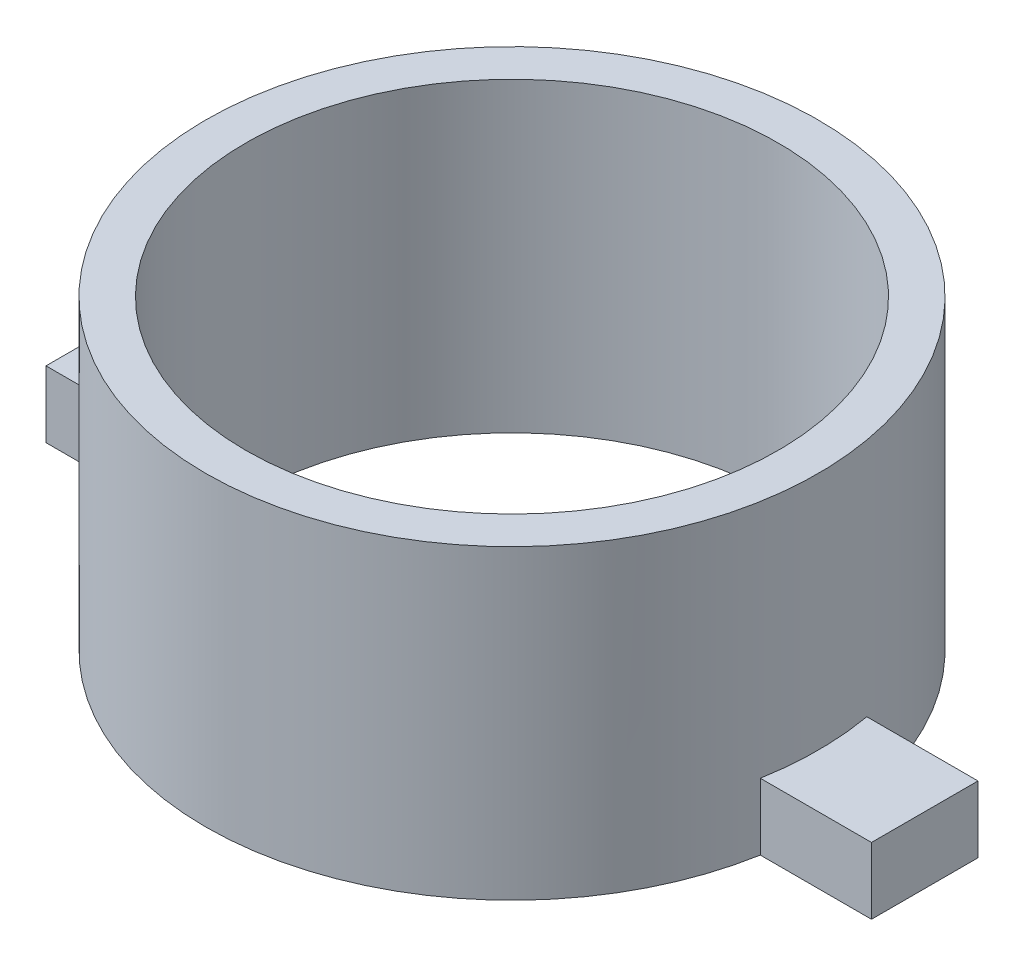
ISO-10303-21;
HEADER;
FILE_DESCRIPTION(('STEP AP214'),'2;1');
FILE_NAME('part.step','',(''),(''),'','','');
FILE_SCHEMA(('AUTOMOTIVE_DESIGN { 1 0 10303 214 1 1 1 1 }'));
ENDSEC;
DATA;
#1=APPLICATION_CONTEXT('core data for automotive mechanical design processes');
#2=APPLICATION_PROTOCOL_DEFINITION('international standard','automotive_design',2000,#1);
#3=PRODUCT_CONTEXT('',#1,'mechanical');
#4=PRODUCT('Part','Part','',(#3));
#5=PRODUCT_RELATED_PRODUCT_CATEGORY('part','',(#4));
#6=PRODUCT_DEFINITION_FORMATION('','',#4);
#7=PRODUCT_DEFINITION_CONTEXT('part definition',#1,'design');
#8=PRODUCT_DEFINITION('design','',#6,#7);
#9=PRODUCT_DEFINITION_SHAPE('','',#8);
#10=(LENGTH_UNIT() NAMED_UNIT(*) SI_UNIT(.MILLI.,.METRE.));
#11=(NAMED_UNIT(*) PLANE_ANGLE_UNIT() SI_UNIT($,.RADIAN.));
#12=(NAMED_UNIT(*) SI_UNIT($,.STERADIAN.) SOLID_ANGLE_UNIT());
#13=UNCERTAINTY_MEASURE_WITH_UNIT(LENGTH_MEASURE(1.E-05),#10,'distance_accuracy_value','');
#14=(GEOMETRIC_REPRESENTATION_CONTEXT(3) GLOBAL_UNCERTAINTY_ASSIGNED_CONTEXT((#13)) GLOBAL_UNIT_ASSIGNED_CONTEXT((#10,
#11,#12)) REPRESENTATION_CONTEXT('',''));
#15=CARTESIAN_POINT('',(0.,0.,0.));
#16=DIRECTION('',(0.,0.,1.));
#17=DIRECTION('',(1.,0.,0.));
#18=AXIS2_PLACEMENT_3D('',#15,#16,#17);
#19=CARTESIAN_POINT('',(0.,23.,0.));
#20=DIRECTION('',(0.,1.,0.));
#21=DIRECTION('',(0.,0.,1.));
#22=AXIS2_PLACEMENT_3D('',#19,#20,#21);
#23=PLANE('',#22);
#24=CARTESIAN_POINT('',(0.,23.,0.));
#25=DIRECTION('',(0.,1.,0.));
#26=DIRECTION('',(0.,0.,1.));
#27=AXIS2_PLACEMENT_3D('',#24,#25,#26);
#28=CIRCLE('',#27,23.);
#29=CARTESIAN_POINT('',(0.,23.,23.));
#30=VERTEX_POINT('',#29);
#31=EDGE_CURVE('E159',#30,#30,#28,.T.);
#32=ORIENTED_EDGE('',*,*,#31,.T.);
#33=EDGE_LOOP('',(#32));
#34=FACE_BOUND('',#33,.T.);
#35=CARTESIAN_POINT('',(0.,23.,0.));
#36=DIRECTION('',(0.,1.,0.));
#37=DIRECTION('',(0.,0.,1.));
#38=AXIS2_PLACEMENT_3D('',#35,#36,#37);
#39=CIRCLE('',#38,20.);
#40=CARTESIAN_POINT('',(0.,23.,20.));
#41=VERTEX_POINT('',#40);
#42=EDGE_CURVE('E153',#41,#41,#39,.T.);
#43=ORIENTED_EDGE('',*,*,#42,.F.);
#44=EDGE_LOOP('',(#43));
#45=FACE_BOUND('',#44,.T.);
#46=ADVANCED_FACE('F37',(#34,#45),#23,.T.);
#47=CARTESIAN_POINT('',(0.,0.,0.));
#48=DIRECTION('',(0.,1.,0.));
#49=DIRECTION('',(0.,0.,1.));
#50=AXIS2_PLACEMENT_3D('',#47,#48,#49);
#51=PLANE('',#50);
#52=DIRECTION('',(-1.,0.,0.));
#53=VECTOR('',#52,1.);
#54=CARTESIAN_POINT('',(22.,0.,4.));
#55=LINE('',#54,#53);
#56=CARTESIAN_POINT('',(31.,0.,4.));
#57=VERTEX_POINT('',#56);
#58=CARTESIAN_POINT('',(22.6495033058122,0.,4.));
#59=VERTEX_POINT('',#58);
#60=EDGE_CURVE('E104',#57,#59,#55,.T.);
#61=ORIENTED_EDGE('',*,*,#60,.T.);
#62=CARTESIAN_POINT('',(0.,0.,0.));
#63=DIRECTION('',(0.,1.,0.));
#64=DIRECTION('',(0.,0.,1.));
#65=AXIS2_PLACEMENT_3D('',#62,#63,#64);
#66=CIRCLE('',#65,23.);
#67=CARTESIAN_POINT('',(-22.6495033058122,0.,4.));
#68=VERTEX_POINT('',#67);
#69=EDGE_CURVE('E163',#68,#59,#66,.T.);
#70=ORIENTED_EDGE('',*,*,#69,.F.);
#71=DIRECTION('',(1.,0.,0.));
#72=VECTOR('',#71,1.);
#73=CARTESIAN_POINT('',(-22.,0.,4.));
#74=LINE('',#73,#72);
#75=CARTESIAN_POINT('',(-31.,0.,4.));
#76=VERTEX_POINT('',#75);
#77=EDGE_CURVE('E138',#76,#68,#74,.T.);
#78=ORIENTED_EDGE('',*,*,#77,.F.);
#79=DIRECTION('',(0.,0.,-1.));
#80=VECTOR('',#79,1.);
#81=CARTESIAN_POINT('',(-31.,0.,4.));
#82=LINE('',#81,#80);
#83=CARTESIAN_POINT('',(-31.,0.,-4.));
#84=VERTEX_POINT('',#83);
#85=EDGE_CURVE('E141',#76,#84,#82,.T.);
#86=ORIENTED_EDGE('',*,*,#85,.T.);
#87=DIRECTION('',(1.,0.,0.));
#88=VECTOR('',#87,1.);
#89=CARTESIAN_POINT('',(-22.,0.,-4.));
#90=LINE('',#89,#88);
#91=CARTESIAN_POINT('',(-22.6495033058122,0.,-4.));
#92=VERTEX_POINT('',#91);
#93=EDGE_CURVE('E136',#84,#92,#90,.T.);
#94=ORIENTED_EDGE('',*,*,#93,.T.);
#95=CARTESIAN_POINT('',(22.6495033058122,0.,-4.));
#96=VERTEX_POINT('',#95);
#97=EDGE_CURVE('E156',#96,#92,#66,.T.);
#98=ORIENTED_EDGE('',*,*,#97,.F.);
#99=DIRECTION('',(-1.,0.,0.));
#100=VECTOR('',#99,1.);
#101=CARTESIAN_POINT('',(22.,0.,-4.));
#102=LINE('',#101,#100);
#103=CARTESIAN_POINT('',(31.,0.,-4.));
#104=VERTEX_POINT('',#103);
#105=EDGE_CURVE('E106',#104,#96,#102,.T.);
#106=ORIENTED_EDGE('',*,*,#105,.F.);
#107=DIRECTION('',(0.,0.,-1.));
#108=VECTOR('',#107,1.);
#109=CARTESIAN_POINT('',(31.,0.,4.));
#110=LINE('',#109,#108);
#111=EDGE_CURVE('E99',#57,#104,#110,.T.);
#112=ORIENTED_EDGE('',*,*,#111,.F.);
#113=EDGE_LOOP('',(#61,#70,#78,#86,#94,#98,#106,#112));
#114=FACE_BOUND('',#113,.T.);
#115=CARTESIAN_POINT('',(0.,0.,0.));
#116=DIRECTION('',(0.,1.,0.));
#117=DIRECTION('',(0.,0.,1.));
#118=AXIS2_PLACEMENT_3D('',#115,#116,#117);
#119=CIRCLE('',#118,20.);
#120=CARTESIAN_POINT('',(0.,0.,20.));
#121=VERTEX_POINT('',#120);
#122=EDGE_CURVE('E152',#121,#121,#119,.T.);
#123=ORIENTED_EDGE('',*,*,#122,.T.);
#124=EDGE_LOOP('',(#123));
#125=FACE_BOUND('',#124,.T.);
#126=ADVANCED_FACE('F101',(#114,#125),#51,.F.);
#127=CARTESIAN_POINT('',(0.,23.,0.));
#128=DIRECTION('',(0.,-1.,0.));
#129=DIRECTION('',(0.,0.,-1.));
#130=AXIS2_PLACEMENT_3D('',#127,#128,#129);
#131=CYLINDRICAL_SURFACE('',#130,23.);
#132=ORIENTED_EDGE('',*,*,#31,.F.);
#133=EDGE_LOOP('',(#132));
#134=FACE_BOUND('',#133,.T.);
#135=ORIENTED_EDGE('',*,*,#69,.T.);
#136=DIRECTION('',(0.,-1.,0.));
#137=VECTOR('',#136,1.);
#138=CARTESIAN_POINT('',(22.6495033058122,23.,4.));
#139=LINE('',#138,#137);
#140=CARTESIAN_POINT('',(22.6495033058122,5.,4.));
#141=VERTEX_POINT('',#140);
#142=EDGE_CURVE('E11',#59,#141,#139,.F.);
#143=ORIENTED_EDGE('',*,*,#142,.T.);
#144=CARTESIAN_POINT('',(0.,4.99999999999999,0.));
#145=DIRECTION('',(0.,1.,0.));
#146=DIRECTION('',(-1.,0.,0.));
#147=AXIS2_PLACEMENT_3D('',#144,#145,#146);
#148=CIRCLE('',#147,23.);
#149=CARTESIAN_POINT('',(22.6495033058122,5.,-4.));
#150=VERTEX_POINT('',#149);
#151=EDGE_CURVE('E45',#141,#150,#148,.T.);
#152=ORIENTED_EDGE('',*,*,#151,.T.);
#153=DIRECTION('',(0.,-1.,0.));
#154=VECTOR('',#153,1.);
#155=CARTESIAN_POINT('',(22.6495033058122,23.,-4.));
#156=LINE('',#155,#154);
#157=EDGE_CURVE('E56',#96,#150,#156,.F.);
#158=ORIENTED_EDGE('',*,*,#157,.F.);
#159=ORIENTED_EDGE('',*,*,#97,.T.);
#160=DIRECTION('',(0.,-1.,0.));
#161=VECTOR('',#160,1.);
#162=CARTESIAN_POINT('',(-22.6495033058122,23.,-4.));
#163=LINE('',#162,#161);
#164=CARTESIAN_POINT('',(-22.6495033058122,5.,-4.));
#165=VERTEX_POINT('',#164);
#166=EDGE_CURVE('E162',#165,#92,#163,.T.);
#167=ORIENTED_EDGE('',*,*,#166,.F.);
#168=CARTESIAN_POINT('',(0.,4.99999999999999,0.));
#169=DIRECTION('',(0.,-1.,0.));
#170=DIRECTION('',(1.,0.,0.));
#171=AXIS2_PLACEMENT_3D('',#168,#169,#170);
#172=CIRCLE('',#171,23.);
#173=CARTESIAN_POINT('',(-22.6495033058122,5.,4.));
#174=VERTEX_POINT('',#173);
#175=EDGE_CURVE('E167',#174,#165,#172,.T.);
#176=ORIENTED_EDGE('',*,*,#175,.F.);
#177=DIRECTION('',(0.,-1.,0.));
#178=VECTOR('',#177,1.);
#179=CARTESIAN_POINT('',(-22.6495033058122,23.,4.));
#180=LINE('',#179,#178);
#181=EDGE_CURVE('E170',#174,#68,#180,.T.);
#182=ORIENTED_EDGE('',*,*,#181,.T.);
#183=EDGE_LOOP('',(#135,#143,#152,#158,#159,#167,#176,#182));
#184=FACE_BOUND('',#183,.T.);
#185=ADVANCED_FACE('F39',(#134,#184),#131,.T.);
#186=CARTESIAN_POINT('',(0.,23.,0.));
#187=DIRECTION('',(0.,-1.,0.));
#188=DIRECTION('',(0.,0.,-1.));
#189=AXIS2_PLACEMENT_3D('',#186,#187,#188);
#190=CYLINDRICAL_SURFACE('',#189,20.);
#191=ORIENTED_EDGE('',*,*,#42,.T.);
#192=EDGE_LOOP('',(#191));
#193=FACE_BOUND('',#192,.T.);
#194=ORIENTED_EDGE('',*,*,#122,.F.);
#195=EDGE_LOOP('',(#194));
#196=FACE_BOUND('',#195,.T.);
#197=ADVANCED_FACE('F192',(#193,#196),#190,.F.);
#198=CARTESIAN_POINT('',(0.,0.,4.));
#199=DIRECTION('',(0.,0.,1.));
#200=DIRECTION('',(1.,0.,0.));
#201=AXIS2_PLACEMENT_3D('',#198,#199,#200);
#202=PLANE('',#201);
#203=ORIENTED_EDGE('',*,*,#181,.F.);
#204=DIRECTION('',(-1.,0.,0.));
#205=VECTOR('',#204,1.);
#206=CARTESIAN_POINT('',(-22.,5.,4.));
#207=LINE('',#206,#205);
#208=CARTESIAN_POINT('',(-31.,5.,4.));
#209=VERTEX_POINT('',#208);
#210=EDGE_CURVE('E133',#174,#209,#207,.T.);
#211=ORIENTED_EDGE('',*,*,#210,.T.);
#212=DIRECTION('',(0.,-1.,0.));
#213=VECTOR('',#212,1.);
#214=CARTESIAN_POINT('',(-31.,0.,4.));
#215=LINE('',#214,#213);
#216=EDGE_CURVE('E135',#209,#76,#215,.T.);
#217=ORIENTED_EDGE('',*,*,#216,.T.);
#218=ORIENTED_EDGE('',*,*,#77,.T.);
#219=EDGE_LOOP('',(#203,#211,#217,#218));
#220=FACE_BOUND('',#219,.T.);
#221=ADVANCED_FACE('F195',(#220),#202,.T.);
#222=CARTESIAN_POINT('',(0.,0.,-4.));
#223=DIRECTION('',(0.,0.,1.));
#224=DIRECTION('',(1.,0.,0.));
#225=AXIS2_PLACEMENT_3D('',#222,#223,#224);
#226=PLANE('',#225);
#227=DIRECTION('',(-1.,0.,0.));
#228=VECTOR('',#227,1.);
#229=CARTESIAN_POINT('',(-22.,5.,-4.));
#230=LINE('',#229,#228);
#231=CARTESIAN_POINT('',(-31.,5.,-4.));
#232=VERTEX_POINT('',#231);
#233=EDGE_CURVE('E111',#165,#232,#230,.T.);
#234=ORIENTED_EDGE('',*,*,#233,.F.);
#235=ORIENTED_EDGE('',*,*,#166,.T.);
#236=ORIENTED_EDGE('',*,*,#93,.F.);
#237=DIRECTION('',(0.,-1.,0.));
#238=VECTOR('',#237,1.);
#239=CARTESIAN_POINT('',(-31.,0.,-4.));
#240=LINE('',#239,#238);
#241=EDGE_CURVE('E143',#232,#84,#240,.T.);
#242=ORIENTED_EDGE('',*,*,#241,.F.);
#243=EDGE_LOOP('',(#234,#235,#236,#242));
#244=FACE_BOUND('',#243,.T.);
#245=ADVANCED_FACE('F201',(#244),#226,.F.);
#246=CARTESIAN_POINT('',(-22.,5.,4.));
#247=DIRECTION('',(0.,-1.,0.));
#248=DIRECTION('',(1.,0.,0.));
#249=AXIS2_PLACEMENT_3D('',#246,#247,#248);
#250=PLANE('',#249);
#251=ORIENTED_EDGE('',*,*,#210,.F.);
#252=ORIENTED_EDGE('',*,*,#175,.T.);
#253=ORIENTED_EDGE('',*,*,#233,.T.);
#254=DIRECTION('',(0.,0.,-1.));
#255=VECTOR('',#254,1.);
#256=CARTESIAN_POINT('',(-31.,5.,4.));
#257=LINE('',#256,#255);
#258=EDGE_CURVE('E149',#209,#232,#257,.T.);
#259=ORIENTED_EDGE('',*,*,#258,.F.);
#260=EDGE_LOOP('',(#251,#252,#253,#259));
#261=FACE_BOUND('',#260,.T.);
#262=ADVANCED_FACE('F197',(#261),#250,.F.);
#263=CARTESIAN_POINT('',(-31.,0.,4.));
#264=DIRECTION('',(1.,0.,0.));
#265=DIRECTION('',(0.,0.,-1.));
#266=AXIS2_PLACEMENT_3D('',#263,#264,#265);
#267=PLANE('',#266);
#268=ORIENTED_EDGE('',*,*,#241,.T.);
#269=ORIENTED_EDGE('',*,*,#85,.F.);
#270=ORIENTED_EDGE('',*,*,#216,.F.);
#271=ORIENTED_EDGE('',*,*,#258,.T.);
#272=EDGE_LOOP('',(#268,#269,#270,#271));
#273=FACE_BOUND('',#272,.T.);
#274=ADVANCED_FACE('F200',(#273),#267,.F.);
#275=CARTESIAN_POINT('',(0.,0.,4.));
#276=DIRECTION('',(0.,0.,1.));
#277=DIRECTION('',(-1.,0.,0.));
#278=AXIS2_PLACEMENT_3D('',#275,#276,#277);
#279=PLANE('',#278);
#280=ORIENTED_EDGE('',*,*,#142,.F.);
#281=ORIENTED_EDGE('',*,*,#60,.F.);
#282=DIRECTION('',(0.,-1.,0.));
#283=VECTOR('',#282,1.);
#284=CARTESIAN_POINT('',(31.,0.,4.));
#285=LINE('',#284,#283);
#286=CARTESIAN_POINT('',(31.,5.,4.));
#287=VERTEX_POINT('',#286);
#288=EDGE_CURVE('E118',#287,#57,#285,.T.);
#289=ORIENTED_EDGE('',*,*,#288,.F.);
#290=DIRECTION('',(1.,0.,0.));
#291=VECTOR('',#290,1.);
#292=CARTESIAN_POINT('',(22.,5.,4.));
#293=LINE('',#292,#291);
#294=EDGE_CURVE('E124',#141,#287,#293,.T.);
#295=ORIENTED_EDGE('',*,*,#294,.F.);
#296=EDGE_LOOP('',(#280,#281,#289,#295));
#297=FACE_BOUND('',#296,.T.);
#298=ADVANCED_FACE('F116',(#297),#279,.T.);
#299=CARTESIAN_POINT('',(0.,0.,-4.));
#300=DIRECTION('',(0.,0.,1.));
#301=DIRECTION('',(-1.,0.,0.));
#302=AXIS2_PLACEMENT_3D('',#299,#300,#301);
#303=PLANE('',#302);
#304=ORIENTED_EDGE('',*,*,#105,.T.);
#305=ORIENTED_EDGE('',*,*,#157,.T.);
#306=DIRECTION('',(1.,0.,0.));
#307=VECTOR('',#306,1.);
#308=CARTESIAN_POINT('',(22.,5.,-4.));
#309=LINE('',#308,#307);
#310=CARTESIAN_POINT('',(31.,5.,-4.));
#311=VERTEX_POINT('',#310);
#312=EDGE_CURVE('E119',#150,#311,#309,.T.);
#313=ORIENTED_EDGE('',*,*,#312,.T.);
#314=DIRECTION('',(0.,-1.,0.));
#315=VECTOR('',#314,1.);
#316=CARTESIAN_POINT('',(31.,0.,-4.));
#317=LINE('',#316,#315);
#318=EDGE_CURVE('E129',#311,#104,#317,.T.);
#319=ORIENTED_EDGE('',*,*,#318,.T.);
#320=EDGE_LOOP('',(#304,#305,#313,#319));
#321=FACE_BOUND('',#320,.T.);
#322=ADVANCED_FACE('F175',(#321),#303,.F.);
#323=CARTESIAN_POINT('',(31.,0.,4.));
#324=DIRECTION('',(1.,0.,0.));
#325=DIRECTION('',(0.,0.,-1.));
#326=AXIS2_PLACEMENT_3D('',#323,#324,#325);
#327=PLANE('',#326);
#328=ORIENTED_EDGE('',*,*,#318,.F.);
#329=DIRECTION('',(0.,0.,-1.));
#330=VECTOR('',#329,1.);
#331=CARTESIAN_POINT('',(31.,5.,4.));
#332=LINE('',#331,#330);
#333=EDGE_CURVE('E112',#287,#311,#332,.T.);
#334=ORIENTED_EDGE('',*,*,#333,.F.);
#335=ORIENTED_EDGE('',*,*,#288,.T.);
#336=ORIENTED_EDGE('',*,*,#111,.T.);
#337=EDGE_LOOP('',(#328,#334,#335,#336));
#338=FACE_BOUND('',#337,.T.);
#339=ADVANCED_FACE('F122',(#338),#327,.T.);
#340=CARTESIAN_POINT('',(22.,5.,4.));
#341=DIRECTION('',(0.,1.,0.));
#342=DIRECTION('',(-1.,0.,0.));
#343=AXIS2_PLACEMENT_3D('',#340,#341,#342);
#344=PLANE('',#343);
#345=ORIENTED_EDGE('',*,*,#151,.F.);
#346=ORIENTED_EDGE('',*,*,#294,.T.);
#347=ORIENTED_EDGE('',*,*,#333,.T.);
#348=ORIENTED_EDGE('',*,*,#312,.F.);
#349=EDGE_LOOP('',(#345,#346,#347,#348));
#350=FACE_BOUND('',#349,.T.);
#351=ADVANCED_FACE('F176',(#350),#344,.T.);
#352=CLOSED_SHELL('',(#46,#126,#185,#197,#221,#245,#262,#274,#298,#322,#339,#351));
#353=MANIFOLD_SOLID_BREP('B2',#352);
#354=ADVANCED_BREP_SHAPE_REPRESENTATION('',(#18,#353),#14);
#355=SHAPE_DEFINITION_REPRESENTATION(#9,#354);
ENDSEC;
END-ISO-10303-21;
